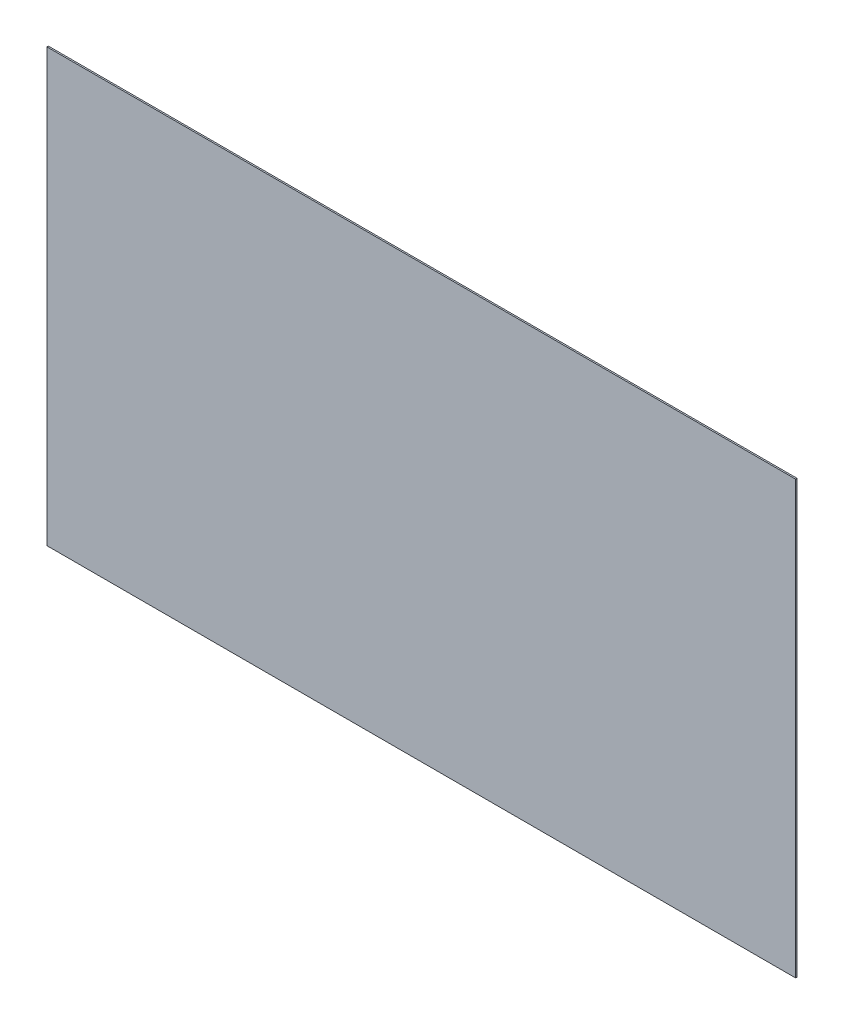
ISO-10303-21;
HEADER;
FILE_DESCRIPTION(('STEP AP214'),'2;1');
FILE_NAME('part.step','',(''),(''),'','','');
FILE_SCHEMA(('AUTOMOTIVE_DESIGN { 1 0 10303 214 1 1 1 1 }'));
ENDSEC;
DATA;
#1=APPLICATION_CONTEXT('core data for automotive mechanical design processes');
#2=APPLICATION_PROTOCOL_DEFINITION('international standard','automotive_design',2000,#1);
#3=PRODUCT_CONTEXT('',#1,'mechanical');
#4=PRODUCT('Part','Part','',(#3));
#5=PRODUCT_RELATED_PRODUCT_CATEGORY('part','',(#4));
#6=PRODUCT_DEFINITION_FORMATION('','',#4);
#7=PRODUCT_DEFINITION_CONTEXT('part definition',#1,'design');
#8=PRODUCT_DEFINITION('design','',#6,#7);
#9=PRODUCT_DEFINITION_SHAPE('','',#8);
#10=(LENGTH_UNIT() NAMED_UNIT(*) SI_UNIT(.MILLI.,.METRE.));
#11=(NAMED_UNIT(*) PLANE_ANGLE_UNIT() SI_UNIT($,.RADIAN.));
#12=(NAMED_UNIT(*) SI_UNIT($,.STERADIAN.) SOLID_ANGLE_UNIT());
#13=UNCERTAINTY_MEASURE_WITH_UNIT(LENGTH_MEASURE(1.E-05),#10,'distance_accuracy_value','');
#14=(GEOMETRIC_REPRESENTATION_CONTEXT(3) GLOBAL_UNCERTAINTY_ASSIGNED_CONTEXT((#13)) GLOBAL_UNIT_ASSIGNED_CONTEXT((#10,
#11,#12)) REPRESENTATION_CONTEXT('',''));
#15=CARTESIAN_POINT('',(0.,0.,0.));
#16=DIRECTION('',(0.,0.,1.));
#17=DIRECTION('',(1.,0.,0.));
#18=AXIS2_PLACEMENT_3D('',#15,#16,#17);
#19=CARTESIAN_POINT('',(26.,-15.,0.1));
#20=DIRECTION('',(-1.,0.,0.));
#21=DIRECTION('',(0.,0.,1.));
#22=AXIS2_PLACEMENT_3D('',#19,#20,#21);
#23=PLANE('',#22);
#24=DIRECTION('',(0.,1.,0.));
#25=VECTOR('',#24,1.);
#26=CARTESIAN_POINT('',(26.,-15.,0.));
#27=LINE('',#26,#25);
#28=CARTESIAN_POINT('',(26.,-15.,0.));
#29=VERTEX_POINT('',#28);
#30=CARTESIAN_POINT('',(26.,15.,0.));
#31=VERTEX_POINT('',#30);
#32=EDGE_CURVE('E100',#29,#31,#27,.T.);
#33=ORIENTED_EDGE('',*,*,#32,.T.);
#34=DIRECTION('',(0.,0.,-1.));
#35=VECTOR('',#34,1.);
#36=CARTESIAN_POINT('',(26.,15.,0.1));
#37=LINE('',#36,#35);
#38=CARTESIAN_POINT('',(26.,15.,0.1));
#39=VERTEX_POINT('',#38);
#40=EDGE_CURVE('E11',#39,#31,#37,.T.);
#41=ORIENTED_EDGE('',*,*,#40,.F.);
#42=DIRECTION('',(0.,1.,0.));
#43=VECTOR('',#42,1.);
#44=CARTESIAN_POINT('',(26.,-15.,0.1));
#45=LINE('',#44,#43);
#46=CARTESIAN_POINT('',(26.,-15.,0.1));
#47=VERTEX_POINT('',#46);
#48=EDGE_CURVE('E88',#47,#39,#45,.T.);
#49=ORIENTED_EDGE('',*,*,#48,.F.);
#50=DIRECTION('',(0.,0.,-1.));
#51=VECTOR('',#50,1.);
#52=CARTESIAN_POINT('',(26.,-15.,0.1));
#53=LINE('',#52,#51);
#54=EDGE_CURVE('E96',#47,#29,#53,.T.);
#55=ORIENTED_EDGE('',*,*,#54,.T.);
#56=EDGE_LOOP('',(#33,#41,#49,#55));
#57=FACE_BOUND('',#56,.T.);
#58=ADVANCED_FACE('F37',(#57),#23,.F.);
#59=CARTESIAN_POINT('',(-26.,15.,0.1));
#60=DIRECTION('',(0.,-1.,0.));
#61=DIRECTION('',(0.,0.,-1.));
#62=AXIS2_PLACEMENT_3D('',#59,#60,#61);
#63=PLANE('',#62);
#64=DIRECTION('',(-1.,0.,0.));
#65=VECTOR('',#64,1.);
#66=CARTESIAN_POINT('',(-26.,15.,0.));
#67=LINE('',#66,#65);
#68=CARTESIAN_POINT('',(-26.,15.,0.));
#69=VERTEX_POINT('',#68);
#70=EDGE_CURVE('E92',#31,#69,#67,.T.);
#71=ORIENTED_EDGE('',*,*,#70,.T.);
#72=DIRECTION('',(0.,0.,-1.));
#73=VECTOR('',#72,1.);
#74=CARTESIAN_POINT('',(-26.,15.,0.1));
#75=LINE('',#74,#73);
#76=CARTESIAN_POINT('',(-26.,15.,0.1));
#77=VERTEX_POINT('',#76);
#78=EDGE_CURVE('E45',#77,#69,#75,.T.);
#79=ORIENTED_EDGE('',*,*,#78,.F.);
#80=DIRECTION('',(-1.,0.,0.));
#81=VECTOR('',#80,1.);
#82=CARTESIAN_POINT('',(-26.,15.,0.1));
#83=LINE('',#82,#81);
#84=EDGE_CURVE('E83',#39,#77,#83,.T.);
#85=ORIENTED_EDGE('',*,*,#84,.F.);
#86=ORIENTED_EDGE('',*,*,#40,.T.);
#87=EDGE_LOOP('',(#71,#79,#85,#86));
#88=FACE_BOUND('',#87,.T.);
#89=ADVANCED_FACE('F91',(#88),#63,.F.);
#90=CARTESIAN_POINT('',(-26.,-15.,0.1));
#91=DIRECTION('',(1.,0.,0.));
#92=DIRECTION('',(0.,0.,-1.));
#93=AXIS2_PLACEMENT_3D('',#90,#91,#92);
#94=PLANE('',#93);
#95=DIRECTION('',(0.,-1.,0.));
#96=VECTOR('',#95,1.);
#97=CARTESIAN_POINT('',(-26.,-15.,0.));
#98=LINE('',#97,#96);
#99=CARTESIAN_POINT('',(-26.,-15.,0.));
#100=VERTEX_POINT('',#99);
#101=EDGE_CURVE('E70',#69,#100,#98,.T.);
#102=ORIENTED_EDGE('',*,*,#101,.T.);
#103=DIRECTION('',(0.,0.,-1.));
#104=VECTOR('',#103,1.);
#105=CARTESIAN_POINT('',(-26.,-15.,0.1));
#106=LINE('',#105,#104);
#107=CARTESIAN_POINT('',(-26.,-15.,0.1));
#108=VERTEX_POINT('',#107);
#109=EDGE_CURVE('E93',#108,#100,#106,.T.);
#110=ORIENTED_EDGE('',*,*,#109,.F.);
#111=DIRECTION('',(0.,-1.,0.));
#112=VECTOR('',#111,1.);
#113=CARTESIAN_POINT('',(-26.,-15.,0.1));
#114=LINE('',#113,#112);
#115=EDGE_CURVE('E86',#77,#108,#114,.T.);
#116=ORIENTED_EDGE('',*,*,#115,.F.);
#117=ORIENTED_EDGE('',*,*,#78,.T.);
#118=EDGE_LOOP('',(#102,#110,#116,#117));
#119=FACE_BOUND('',#118,.T.);
#120=ADVANCED_FACE('F94',(#119),#94,.F.);
#121=CARTESIAN_POINT('',(-26.,-15.,0.1));
#122=DIRECTION('',(0.,1.,0.));
#123=DIRECTION('',(0.,0.,1.));
#124=AXIS2_PLACEMENT_3D('',#121,#122,#123);
#125=PLANE('',#124);
#126=DIRECTION('',(1.,0.,0.));
#127=VECTOR('',#126,1.);
#128=CARTESIAN_POINT('',(-26.,-15.,0.));
#129=LINE('',#128,#127);
#130=EDGE_CURVE('E76',#100,#29,#129,.T.);
#131=ORIENTED_EDGE('',*,*,#130,.T.);
#132=ORIENTED_EDGE('',*,*,#54,.F.);
#133=DIRECTION('',(1.,0.,0.));
#134=VECTOR('',#133,1.);
#135=CARTESIAN_POINT('',(-26.,-15.,0.1));
#136=LINE('',#135,#134);
#137=EDGE_CURVE('E53',#108,#47,#136,.T.);
#138=ORIENTED_EDGE('',*,*,#137,.F.);
#139=ORIENTED_EDGE('',*,*,#109,.T.);
#140=EDGE_LOOP('',(#131,#132,#138,#139));
#141=FACE_BOUND('',#140,.T.);
#142=ADVANCED_FACE('F107',(#141),#125,.F.);
#143=CARTESIAN_POINT('',(0.,0.,0.1));
#144=DIRECTION('',(0.,0.,-1.));
#145=DIRECTION('',(-1.,0.,0.));
#146=AXIS2_PLACEMENT_3D('',#143,#144,#145);
#147=PLANE('',#146);
#148=ORIENTED_EDGE('',*,*,#48,.T.);
#149=ORIENTED_EDGE('',*,*,#84,.T.);
#150=ORIENTED_EDGE('',*,*,#115,.T.);
#151=ORIENTED_EDGE('',*,*,#137,.T.);
#152=EDGE_LOOP('',(#148,#149,#150,#151));
#153=FACE_BOUND('',#152,.T.);
#154=ADVANCED_FACE('F84',(#153),#147,.F.);
#155=CARTESIAN_POINT('',(0.,0.,0.));
#156=DIRECTION('',(0.,0.,-1.));
#157=DIRECTION('',(-1.,0.,0.));
#158=AXIS2_PLACEMENT_3D('',#155,#156,#157);
#159=PLANE('',#158);
#160=ORIENTED_EDGE('',*,*,#32,.F.);
#161=ORIENTED_EDGE('',*,*,#130,.F.);
#162=ORIENTED_EDGE('',*,*,#101,.F.);
#163=ORIENTED_EDGE('',*,*,#70,.F.);
#164=EDGE_LOOP('',(#160,#161,#162,#163));
#165=FACE_BOUND('',#164,.T.);
#166=ADVANCED_FACE('F110',(#165),#159,.T.);
#167=CLOSED_SHELL('',(#58,#89,#120,#142,#154,#166));
#168=MANIFOLD_SOLID_BREP('B2',#167);
#169=ADVANCED_BREP_SHAPE_REPRESENTATION('',(#18,#168),#14);
#170=SHAPE_DEFINITION_REPRESENTATION(#9,#169);
ENDSEC;
END-ISO-10303-21;
